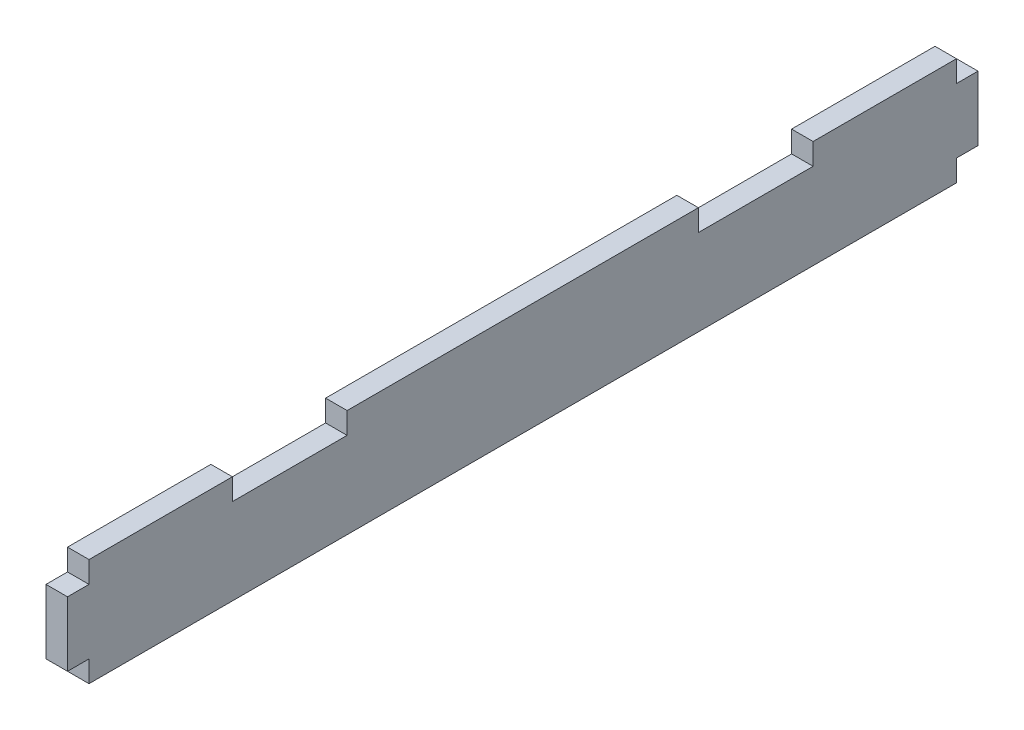
ISO-10303-21;
HEADER;
FILE_DESCRIPTION(('STEP AP214'),'2;1');
FILE_NAME('part.step','',(''),(''),'','','');
FILE_SCHEMA(('AUTOMOTIVE_DESIGN { 1 0 10303 214 1 1 1 1 }'));
ENDSEC;
DATA;
#1=APPLICATION_CONTEXT('core data for automotive mechanical design processes');
#2=APPLICATION_PROTOCOL_DEFINITION('international standard','automotive_design',2000,#1);
#3=PRODUCT_CONTEXT('',#1,'mechanical');
#4=PRODUCT('Part','Part','',(#3));
#5=PRODUCT_RELATED_PRODUCT_CATEGORY('part','',(#4));
#6=PRODUCT_DEFINITION_FORMATION('','',#4);
#7=PRODUCT_DEFINITION_CONTEXT('part definition',#1,'design');
#8=PRODUCT_DEFINITION('design','',#6,#7);
#9=PRODUCT_DEFINITION_SHAPE('','',#8);
#10=(LENGTH_UNIT() NAMED_UNIT(*) SI_UNIT(.MILLI.,.METRE.));
#11=(NAMED_UNIT(*) PLANE_ANGLE_UNIT() SI_UNIT($,.RADIAN.));
#12=(NAMED_UNIT(*) SI_UNIT($,.STERADIAN.) SOLID_ANGLE_UNIT());
#13=UNCERTAINTY_MEASURE_WITH_UNIT(LENGTH_MEASURE(1.E-05),#10,'distance_accuracy_value','');
#14=(GEOMETRIC_REPRESENTATION_CONTEXT(3) GLOBAL_UNCERTAINTY_ASSIGNED_CONTEXT((#13)) GLOBAL_UNIT_ASSIGNED_CONTEXT((#10,
#11,#12)) REPRESENTATION_CONTEXT('',''));
#15=CARTESIAN_POINT('',(0.,0.,0.));
#16=DIRECTION('',(0.,0.,1.));
#17=DIRECTION('',(1.,0.,0.));
#18=AXIS2_PLACEMENT_3D('',#15,#16,#17);
#19=CARTESIAN_POINT('',(3.,0.,-85.));
#20=DIRECTION('',(0.,0.,-1.));
#21=DIRECTION('',(-1.,0.,0.));
#22=AXIS2_PLACEMENT_3D('',#19,#20,#21);
#23=PLANE('',#22);
#24=DIRECTION('',(0.,-1.,0.));
#25=VECTOR('',#24,1.);
#26=CARTESIAN_POINT('',(0.,0.,-85.));
#27=LINE('',#26,#25);
#28=CARTESIAN_POINT('',(0.,15.,-85.));
#29=VERTEX_POINT('',#28);
#30=CARTESIAN_POINT('',(0.,12.,-85.));
#31=VERTEX_POINT('',#30);
#32=EDGE_CURVE('E274',#29,#31,#27,.T.);
#33=ORIENTED_EDGE('',*,*,#32,.F.);
#34=DIRECTION('',(-1.,0.,0.));
#35=VECTOR('',#34,1.);
#36=CARTESIAN_POINT('',(3.,15.,-85.));
#37=LINE('',#36,#35);
#38=CARTESIAN_POINT('',(3.,15.,-85.));
#39=VERTEX_POINT('',#38);
#40=EDGE_CURVE('E11',#39,#29,#37,.T.);
#41=ORIENTED_EDGE('',*,*,#40,.F.);
#42=DIRECTION('',(0.,-1.,0.));
#43=VECTOR('',#42,1.);
#44=CARTESIAN_POINT('',(3.,0.,-85.));
#45=LINE('',#44,#43);
#46=CARTESIAN_POINT('',(3.,12.,-85.));
#47=VERTEX_POINT('',#46);
#48=EDGE_CURVE('E211',#39,#47,#45,.T.);
#49=ORIENTED_EDGE('',*,*,#48,.T.);
#50=DIRECTION('',(-1.,0.,0.));
#51=VECTOR('',#50,1.);
#52=CARTESIAN_POINT('',(3.,12.,-85.));
#53=LINE('',#52,#51);
#54=EDGE_CURVE('E124',#47,#31,#53,.T.);
#55=ORIENTED_EDGE('',*,*,#54,.T.);
#56=EDGE_LOOP('',(#33,#41,#49,#55));
#57=FACE_BOUND('',#56,.T.);
#58=ADVANCED_FACE('F38',(#57),#23,.T.);
#59=CARTESIAN_POINT('',(3.,15.,0.));
#60=DIRECTION('',(0.,1.,0.));
#61=DIRECTION('',(0.,0.,1.));
#62=AXIS2_PLACEMENT_3D('',#59,#60,#61);
#63=PLANE('',#62);
#64=DIRECTION('',(0.,0.,-1.));
#65=VECTOR('',#64,1.);
#66=CARTESIAN_POINT('',(0.,15.,0.));
#67=LINE('',#66,#65);
#68=CARTESIAN_POINT('',(0.,15.,-36.));
#69=VERTEX_POINT('',#68);
#70=EDGE_CURVE('E268',#69,#29,#67,.T.);
#71=ORIENTED_EDGE('',*,*,#70,.F.);
#72=DIRECTION('',(-1.,0.,0.));
#73=VECTOR('',#72,1.);
#74=CARTESIAN_POINT('',(3.,15.,-36.));
#75=LINE('',#74,#73);
#76=CARTESIAN_POINT('',(3.,15.,-36.));
#77=VERTEX_POINT('',#76);
#78=EDGE_CURVE('E46',#77,#69,#75,.T.);
#79=ORIENTED_EDGE('',*,*,#78,.F.);
#80=DIRECTION('',(0.,0.,-1.));
#81=VECTOR('',#80,1.);
#82=CARTESIAN_POINT('',(3.,15.,0.));
#83=LINE('',#82,#81);
#84=EDGE_CURVE('E200',#77,#39,#83,.T.);
#85=ORIENTED_EDGE('',*,*,#84,.T.);
#86=ORIENTED_EDGE('',*,*,#40,.T.);
#87=EDGE_LOOP('',(#71,#79,#85,#86));
#88=FACE_BOUND('',#87,.T.);
#89=ADVANCED_FACE('F273',(#88),#63,.T.);
#90=CARTESIAN_POINT('',(3.,0.,-36.));
#91=DIRECTION('',(0.,0.,-1.));
#92=DIRECTION('',(-1.,0.,0.));
#93=AXIS2_PLACEMENT_3D('',#90,#91,#92);
#94=PLANE('',#93);
#95=DIRECTION('',(0.,-1.,0.));
#96=VECTOR('',#95,1.);
#97=CARTESIAN_POINT('',(0.,0.,-36.));
#98=LINE('',#97,#96);
#99=CARTESIAN_POINT('',(0.,12.,-36.));
#100=VERTEX_POINT('',#99);
#101=EDGE_CURVE('E262',#69,#100,#98,.T.);
#102=ORIENTED_EDGE('',*,*,#101,.T.);
#103=DIRECTION('',(-1.,0.,0.));
#104=VECTOR('',#103,1.);
#105=CARTESIAN_POINT('',(3.,12.,-36.));
#106=LINE('',#105,#104);
#107=CARTESIAN_POINT('',(3.,12.,-36.));
#108=VERTEX_POINT('',#107);
#109=EDGE_CURVE('E255',#108,#100,#106,.T.);
#110=ORIENTED_EDGE('',*,*,#109,.F.);
#111=DIRECTION('',(0.,-1.,0.));
#112=VECTOR('',#111,1.);
#113=CARTESIAN_POINT('',(3.,0.,-36.));
#114=LINE('',#113,#112);
#115=EDGE_CURVE('E210',#77,#108,#114,.T.);
#116=ORIENTED_EDGE('',*,*,#115,.F.);
#117=ORIENTED_EDGE('',*,*,#78,.T.);
#118=EDGE_LOOP('',(#102,#110,#116,#117));
#119=FACE_BOUND('',#118,.T.);
#120=ADVANCED_FACE('F260',(#119),#94,.F.);
#121=CARTESIAN_POINT('',(3.,12.,0.));
#122=DIRECTION('',(0.,1.,0.));
#123=DIRECTION('',(0.,0.,1.));
#124=AXIS2_PLACEMENT_3D('',#121,#122,#123);
#125=PLANE('',#124);
#126=DIRECTION('',(0.,0.,-1.));
#127=VECTOR('',#126,1.);
#128=CARTESIAN_POINT('',(0.,12.,0.));
#129=LINE('',#128,#127);
#130=CARTESIAN_POINT('',(0.,12.,-20.));
#131=VERTEX_POINT('',#130);
#132=EDGE_CURVE('E271',#131,#100,#129,.T.);
#133=ORIENTED_EDGE('',*,*,#132,.F.);
#134=DIRECTION('',(-1.,0.,0.));
#135=VECTOR('',#134,1.);
#136=CARTESIAN_POINT('',(3.,12.,-20.));
#137=LINE('',#136,#135);
#138=CARTESIAN_POINT('',(3.,12.,-20.));
#139=VERTEX_POINT('',#138);
#140=EDGE_CURVE('E253',#139,#131,#137,.T.);
#141=ORIENTED_EDGE('',*,*,#140,.F.);
#142=DIRECTION('',(0.,0.,-1.));
#143=VECTOR('',#142,1.);
#144=CARTESIAN_POINT('',(3.,12.,0.));
#145=LINE('',#144,#143);
#146=EDGE_CURVE('E214',#139,#108,#145,.T.);
#147=ORIENTED_EDGE('',*,*,#146,.T.);
#148=ORIENTED_EDGE('',*,*,#109,.T.);
#149=EDGE_LOOP('',(#133,#141,#147,#148));
#150=FACE_BOUND('',#149,.T.);
#151=ADVANCED_FACE('F323',(#150),#125,.T.);
#152=CARTESIAN_POINT('',(3.,0.,-20.));
#153=DIRECTION('',(0.,0.,-1.));
#154=DIRECTION('',(-1.,0.,0.));
#155=AXIS2_PLACEMENT_3D('',#152,#153,#154);
#156=PLANE('',#155);
#157=DIRECTION('',(0.,-1.,0.));
#158=VECTOR('',#157,1.);
#159=CARTESIAN_POINT('',(0.,0.,-20.));
#160=LINE('',#159,#158);
#161=CARTESIAN_POINT('',(0.,15.,-20.));
#162=VERTEX_POINT('',#161);
#163=EDGE_CURVE('E281',#162,#131,#160,.T.);
#164=ORIENTED_EDGE('',*,*,#163,.F.);
#165=DIRECTION('',(-1.,0.,0.));
#166=VECTOR('',#165,1.);
#167=CARTESIAN_POINT('',(3.,15.,-20.));
#168=LINE('',#167,#166);
#169=CARTESIAN_POINT('',(3.,15.,-20.));
#170=VERTEX_POINT('',#169);
#171=EDGE_CURVE('E251',#170,#162,#168,.T.);
#172=ORIENTED_EDGE('',*,*,#171,.F.);
#173=DIRECTION('',(0.,-1.,0.));
#174=VECTOR('',#173,1.);
#175=CARTESIAN_POINT('',(3.,0.,-20.));
#176=LINE('',#175,#174);
#177=EDGE_CURVE('E208',#170,#139,#176,.T.);
#178=ORIENTED_EDGE('',*,*,#177,.T.);
#179=ORIENTED_EDGE('',*,*,#140,.T.);
#180=EDGE_LOOP('',(#164,#172,#178,#179));
#181=FACE_BOUND('',#180,.T.);
#182=ADVANCED_FACE('F328',(#181),#156,.T.);
#183=CARTESIAN_POINT('',(0.,15.,0.));
#184=VERTEX_POINT('',#183);
#185=EDGE_CURVE('E276',#184,#162,#67,.T.);
#186=ORIENTED_EDGE('',*,*,#185,.F.);
#187=DIRECTION('',(-1.,0.,0.));
#188=VECTOR('',#187,1.);
#189=CARTESIAN_POINT('',(3.,15.,0.));
#190=LINE('',#189,#188);
#191=CARTESIAN_POINT('',(3.,15.,0.));
#192=VERTEX_POINT('',#191);
#193=EDGE_CURVE('E249',#192,#184,#190,.T.);
#194=ORIENTED_EDGE('',*,*,#193,.F.);
#195=EDGE_CURVE('E199',#192,#170,#83,.T.);
#196=ORIENTED_EDGE('',*,*,#195,.T.);
#197=ORIENTED_EDGE('',*,*,#171,.T.);
#198=EDGE_LOOP('',(#186,#194,#196,#197));
#199=FACE_BOUND('',#198,.T.);
#200=ADVANCED_FACE('F319',(#199),#63,.T.);
#201=CARTESIAN_POINT('',(3.,0.,0.));
#202=DIRECTION('',(0.,0.,1.));
#203=DIRECTION('',(1.,0.,0.));
#204=AXIS2_PLACEMENT_3D('',#201,#202,#203);
#205=PLANE('',#204);
#206=DIRECTION('',(0.,1.,0.));
#207=VECTOR('',#206,1.);
#208=CARTESIAN_POINT('',(0.,0.,0.));
#209=LINE('',#208,#207);
#210=CARTESIAN_POINT('',(0.,12.,0.));
#211=VERTEX_POINT('',#210);
#212=EDGE_CURVE('E280',#211,#184,#209,.T.);
#213=ORIENTED_EDGE('',*,*,#212,.F.);
#214=DIRECTION('',(-1.,0.,0.));
#215=VECTOR('',#214,1.);
#216=CARTESIAN_POINT('',(3.,12.,0.));
#217=LINE('',#216,#215);
#218=CARTESIAN_POINT('',(3.,12.,0.));
#219=VERTEX_POINT('',#218);
#220=EDGE_CURVE('E247',#219,#211,#217,.T.);
#221=ORIENTED_EDGE('',*,*,#220,.F.);
#222=DIRECTION('',(0.,1.,0.));
#223=VECTOR('',#222,1.);
#224=CARTESIAN_POINT('',(3.,0.,0.));
#225=LINE('',#224,#223);
#226=EDGE_CURVE('E207',#219,#192,#225,.T.);
#227=ORIENTED_EDGE('',*,*,#226,.T.);
#228=ORIENTED_EDGE('',*,*,#193,.T.);
#229=EDGE_LOOP('',(#213,#221,#227,#228));
#230=FACE_BOUND('',#229,.T.);
#231=ADVANCED_FACE('F327',(#230),#205,.T.);
#232=CARTESIAN_POINT('',(3.,12.,0.));
#233=DIRECTION('',(0.,-1.,0.));
#234=DIRECTION('',(0.,0.,-1.));
#235=AXIS2_PLACEMENT_3D('',#232,#233,#234);
#236=PLANE('',#235);
#237=DIRECTION('',(0.,0.,1.));
#238=VECTOR('',#237,1.);
#239=CARTESIAN_POINT('',(0.,12.,0.));
#240=LINE('',#239,#238);
#241=CARTESIAN_POINT('',(0.,12.,3.));
#242=VERTEX_POINT('',#241);
#243=EDGE_CURVE('E284',#211,#242,#240,.T.);
#244=ORIENTED_EDGE('',*,*,#243,.T.);
#245=DIRECTION('',(-1.,0.,0.));
#246=VECTOR('',#245,1.);
#247=CARTESIAN_POINT('',(3.,12.,3.));
#248=LINE('',#247,#246);
#249=CARTESIAN_POINT('',(3.,12.,3.));
#250=VERTEX_POINT('',#249);
#251=EDGE_CURVE('E244',#250,#242,#248,.T.);
#252=ORIENTED_EDGE('',*,*,#251,.F.);
#253=DIRECTION('',(0.,0.,1.));
#254=VECTOR('',#253,1.);
#255=CARTESIAN_POINT('',(3.,12.,0.));
#256=LINE('',#255,#254);
#257=EDGE_CURVE('E385',#219,#250,#256,.T.);
#258=ORIENTED_EDGE('',*,*,#257,.F.);
#259=ORIENTED_EDGE('',*,*,#220,.T.);
#260=EDGE_LOOP('',(#244,#252,#258,#259));
#261=FACE_BOUND('',#260,.T.);
#262=ADVANCED_FACE('F404',(#261),#236,.F.);
#263=CARTESIAN_POINT('',(3.,0.,3.));
#264=DIRECTION('',(0.,0.,-1.));
#265=DIRECTION('',(0.,1.,0.));
#266=AXIS2_PLACEMENT_3D('',#263,#264,#265);
#267=PLANE('',#266);
#268=DIRECTION('',(0.,-1.,0.));
#269=VECTOR('',#268,1.);
#270=CARTESIAN_POINT('',(0.,0.,3.));
#271=LINE('',#270,#269);
#272=CARTESIAN_POINT('',(0.,3.,3.));
#273=VERTEX_POINT('',#272);
#274=EDGE_CURVE('E292',#242,#273,#271,.T.);
#275=ORIENTED_EDGE('',*,*,#274,.T.);
#276=DIRECTION('',(-1.,0.,0.));
#277=VECTOR('',#276,1.);
#278=CARTESIAN_POINT('',(3.,3.,3.));
#279=LINE('',#278,#277);
#280=CARTESIAN_POINT('',(3.,3.,3.));
#281=VERTEX_POINT('',#280);
#282=EDGE_CURVE('E242',#281,#273,#279,.T.);
#283=ORIENTED_EDGE('',*,*,#282,.F.);
#284=DIRECTION('',(0.,-1.,0.));
#285=VECTOR('',#284,1.);
#286=CARTESIAN_POINT('',(3.,0.,3.));
#287=LINE('',#286,#285);
#288=EDGE_CURVE('E383',#250,#281,#287,.T.);
#289=ORIENTED_EDGE('',*,*,#288,.F.);
#290=ORIENTED_EDGE('',*,*,#251,.T.);
#291=EDGE_LOOP('',(#275,#283,#289,#290));
#292=FACE_BOUND('',#291,.T.);
#293=ADVANCED_FACE('F411',(#292),#267,.F.);
#294=CARTESIAN_POINT('',(3.,3.,0.));
#295=DIRECTION('',(0.,-1.,0.));
#296=DIRECTION('',(0.,0.,-1.));
#297=AXIS2_PLACEMENT_3D('',#294,#295,#296);
#298=PLANE('',#297);
#299=DIRECTION('',(0.,0.,1.));
#300=VECTOR('',#299,1.);
#301=CARTESIAN_POINT('',(0.,3.,0.));
#302=LINE('',#301,#300);
#303=CARTESIAN_POINT('',(0.,3.,0.));
#304=VERTEX_POINT('',#303);
#305=EDGE_CURVE('E295',#304,#273,#302,.T.);
#306=ORIENTED_EDGE('',*,*,#305,.F.);
#307=DIRECTION('',(-1.,0.,0.));
#308=VECTOR('',#307,1.);
#309=CARTESIAN_POINT('',(3.,3.,0.));
#310=LINE('',#309,#308);
#311=CARTESIAN_POINT('',(3.,3.,0.));
#312=VERTEX_POINT('',#311);
#313=EDGE_CURVE('E240',#312,#304,#310,.T.);
#314=ORIENTED_EDGE('',*,*,#313,.F.);
#315=DIRECTION('',(0.,0.,1.));
#316=VECTOR('',#315,1.);
#317=CARTESIAN_POINT('',(3.,3.,0.));
#318=LINE('',#317,#316);
#319=EDGE_CURVE('E380',#312,#281,#318,.T.);
#320=ORIENTED_EDGE('',*,*,#319,.T.);
#321=ORIENTED_EDGE('',*,*,#282,.T.);
#322=EDGE_LOOP('',(#306,#314,#320,#321));
#323=FACE_BOUND('',#322,.T.);
#324=ADVANCED_FACE('F415',(#323),#298,.T.);
#325=CARTESIAN_POINT('',(0.,0.,0.));
#326=VERTEX_POINT('',#325);
#327=EDGE_CURVE('E286',#326,#304,#209,.T.);
#328=ORIENTED_EDGE('',*,*,#327,.F.);
#329=DIRECTION('',(-1.,0.,0.));
#330=VECTOR('',#329,1.);
#331=CARTESIAN_POINT('',(3.,0.,0.));
#332=LINE('',#331,#330);
#333=CARTESIAN_POINT('',(3.,0.,0.));
#334=VERTEX_POINT('',#333);
#335=EDGE_CURVE('E238',#334,#326,#332,.T.);
#336=ORIENTED_EDGE('',*,*,#335,.F.);
#337=EDGE_CURVE('E379',#334,#312,#225,.T.);
#338=ORIENTED_EDGE('',*,*,#337,.T.);
#339=ORIENTED_EDGE('',*,*,#313,.T.);
#340=EDGE_LOOP('',(#328,#336,#338,#339));
#341=FACE_BOUND('',#340,.T.);
#342=ADVANCED_FACE('F354',(#341),#205,.T.);
#343=CARTESIAN_POINT('',(3.,0.,0.));
#344=DIRECTION('',(0.,1.,0.));
#345=DIRECTION('',(0.,0.,1.));
#346=AXIS2_PLACEMENT_3D('',#343,#344,#345);
#347=PLANE('',#346);
#348=DIRECTION('',(0.,0.,-1.));
#349=VECTOR('',#348,1.);
#350=CARTESIAN_POINT('',(0.,0.,0.));
#351=LINE('',#350,#349);
#352=CARTESIAN_POINT('',(0.,0.,-121.));
#353=VERTEX_POINT('',#352);
#354=EDGE_CURVE('E298',#326,#353,#351,.T.);
#355=ORIENTED_EDGE('',*,*,#354,.T.);
#356=DIRECTION('',(-1.,0.,0.));
#357=VECTOR('',#356,1.);
#358=CARTESIAN_POINT('',(3.,0.,-121.));
#359=LINE('',#358,#357);
#360=CARTESIAN_POINT('',(3.,0.,-121.));
#361=VERTEX_POINT('',#360);
#362=EDGE_CURVE('E235',#361,#353,#359,.T.);
#363=ORIENTED_EDGE('',*,*,#362,.F.);
#364=DIRECTION('',(0.,0.,-1.));
#365=VECTOR('',#364,1.);
#366=CARTESIAN_POINT('',(3.,0.,0.));
#367=LINE('',#366,#365);
#368=EDGE_CURVE('E377',#334,#361,#367,.T.);
#369=ORIENTED_EDGE('',*,*,#368,.F.);
#370=ORIENTED_EDGE('',*,*,#335,.T.);
#371=EDGE_LOOP('',(#355,#363,#369,#370));
#372=FACE_BOUND('',#371,.T.);
#373=ADVANCED_FACE('F346',(#372),#347,.F.);
#374=CARTESIAN_POINT('',(3.,0.,-121.));
#375=DIRECTION('',(0.,0.,1.));
#376=DIRECTION('',(1.,0.,0.));
#377=AXIS2_PLACEMENT_3D('',#374,#375,#376);
#378=PLANE('',#377);
#379=DIRECTION('',(0.,1.,0.));
#380=VECTOR('',#379,1.);
#381=CARTESIAN_POINT('',(0.,0.,-121.));
#382=LINE('',#381,#380);
#383=CARTESIAN_POINT('',(0.,3.,-121.));
#384=VERTEX_POINT('',#383);
#385=EDGE_CURVE('E300',#353,#384,#382,.T.);
#386=ORIENTED_EDGE('',*,*,#385,.T.);
#387=DIRECTION('',(-1.,0.,0.));
#388=VECTOR('',#387,1.);
#389=CARTESIAN_POINT('',(3.,3.,-121.));
#390=LINE('',#389,#388);
#391=CARTESIAN_POINT('',(3.,3.,-121.));
#392=VERTEX_POINT('',#391);
#393=EDGE_CURVE('E232',#392,#384,#390,.T.);
#394=ORIENTED_EDGE('',*,*,#393,.F.);
#395=DIRECTION('',(0.,1.,0.));
#396=VECTOR('',#395,1.);
#397=CARTESIAN_POINT('',(3.,0.,-121.));
#398=LINE('',#397,#396);
#399=EDGE_CURVE('E203',#361,#392,#398,.T.);
#400=ORIENTED_EDGE('',*,*,#399,.F.);
#401=ORIENTED_EDGE('',*,*,#362,.T.);
#402=EDGE_LOOP('',(#386,#394,#400,#401));
#403=FACE_BOUND('',#402,.T.);
#404=ADVANCED_FACE('F337',(#403),#378,.F.);
#405=CARTESIAN_POINT('',(3.,3.00000000000007,0.));
#406=DIRECTION('',(0.,1.,0.));
#407=DIRECTION('',(0.,0.,1.));
#408=AXIS2_PLACEMENT_3D('',#405,#406,#407);
#409=PLANE('',#408);
#410=DIRECTION('',(0.,0.,-1.));
#411=VECTOR('',#410,1.);
#412=CARTESIAN_POINT('',(0.,3.00000000000007,0.));
#413=LINE('',#412,#411);
#414=CARTESIAN_POINT('',(0.,3.,-124.));
#415=VERTEX_POINT('',#414);
#416=EDGE_CURVE('E302',#384,#415,#413,.T.);
#417=ORIENTED_EDGE('',*,*,#416,.T.);
#418=DIRECTION('',(-1.,0.,0.));
#419=VECTOR('',#418,1.);
#420=CARTESIAN_POINT('',(3.,3.,-124.));
#421=LINE('',#420,#419);
#422=CARTESIAN_POINT('',(3.,3.,-124.));
#423=VERTEX_POINT('',#422);
#424=EDGE_CURVE('E230',#423,#415,#421,.T.);
#425=ORIENTED_EDGE('',*,*,#424,.F.);
#426=DIRECTION('',(0.,0.,-1.));
#427=VECTOR('',#426,1.);
#428=CARTESIAN_POINT('',(3.,3.00000000000007,0.));
#429=LINE('',#428,#427);
#430=EDGE_CURVE('E365',#392,#423,#429,.T.);
#431=ORIENTED_EDGE('',*,*,#430,.F.);
#432=ORIENTED_EDGE('',*,*,#393,.T.);
#433=EDGE_LOOP('',(#417,#425,#431,#432));
#434=FACE_BOUND('',#433,.T.);
#435=ADVANCED_FACE('F345',(#434),#409,.F.);
#436=CARTESIAN_POINT('',(3.,0.,-124.));
#437=DIRECTION('',(0.,0.,-1.));
#438=DIRECTION('',(-1.,0.,0.));
#439=AXIS2_PLACEMENT_3D('',#436,#437,#438);
#440=PLANE('',#439);
#441=DIRECTION('',(0.,-1.,0.));
#442=VECTOR('',#441,1.);
#443=CARTESIAN_POINT('',(0.,0.,-124.));
#444=LINE('',#443,#442);
#445=CARTESIAN_POINT('',(0.,12.,-124.));
#446=VERTEX_POINT('',#445);
#447=EDGE_CURVE('E305',#446,#415,#444,.T.);
#448=ORIENTED_EDGE('',*,*,#447,.F.);
#449=DIRECTION('',(-1.,0.,0.));
#450=VECTOR('',#449,1.);
#451=CARTESIAN_POINT('',(3.,12.,-124.));
#452=LINE('',#451,#450);
#453=CARTESIAN_POINT('',(3.,12.,-124.));
#454=VERTEX_POINT('',#453);
#455=EDGE_CURVE('E228',#454,#446,#452,.T.);
#456=ORIENTED_EDGE('',*,*,#455,.F.);
#457=DIRECTION('',(0.,-1.,0.));
#458=VECTOR('',#457,1.);
#459=CARTESIAN_POINT('',(3.,0.,-124.));
#460=LINE('',#459,#458);
#461=EDGE_CURVE('E370',#454,#423,#460,.T.);
#462=ORIENTED_EDGE('',*,*,#461,.T.);
#463=ORIENTED_EDGE('',*,*,#424,.T.);
#464=EDGE_LOOP('',(#448,#456,#462,#463));
#465=FACE_BOUND('',#464,.T.);
#466=ADVANCED_FACE('F341',(#465),#440,.T.);
#467=CARTESIAN_POINT('',(3.,12.,0.));
#468=DIRECTION('',(0.,1.,0.));
#469=DIRECTION('',(0.,0.,1.));
#470=AXIS2_PLACEMENT_3D('',#467,#468,#469);
#471=PLANE('',#470);
#472=DIRECTION('',(0.,0.,-1.));
#473=VECTOR('',#472,1.);
#474=CARTESIAN_POINT('',(0.,12.,0.));
#475=LINE('',#474,#473);
#476=CARTESIAN_POINT('',(0.,12.,-121.));
#477=VERTEX_POINT('',#476);
#478=EDGE_CURVE('E307',#477,#446,#475,.T.);
#479=ORIENTED_EDGE('',*,*,#478,.F.);
#480=DIRECTION('',(-1.,0.,0.));
#481=VECTOR('',#480,1.);
#482=CARTESIAN_POINT('',(3.,12.,-121.));
#483=LINE('',#482,#481);
#484=CARTESIAN_POINT('',(3.,12.,-121.));
#485=VERTEX_POINT('',#484);
#486=EDGE_CURVE('E226',#485,#477,#483,.T.);
#487=ORIENTED_EDGE('',*,*,#486,.F.);
#488=DIRECTION('',(0.,0.,-1.));
#489=VECTOR('',#488,1.);
#490=CARTESIAN_POINT('',(3.,12.,0.));
#491=LINE('',#490,#489);
#492=EDGE_CURVE('E201',#485,#454,#491,.T.);
#493=ORIENTED_EDGE('',*,*,#492,.T.);
#494=ORIENTED_EDGE('',*,*,#455,.T.);
#495=EDGE_LOOP('',(#479,#487,#493,#494));
#496=FACE_BOUND('',#495,.T.);
#497=ADVANCED_FACE('F336',(#496),#471,.T.);
#498=CARTESIAN_POINT('',(0.,15.,-121.));
#499=VERTEX_POINT('',#498);
#500=EDGE_CURVE('E278',#477,#499,#382,.T.);
#501=ORIENTED_EDGE('',*,*,#500,.T.);
#502=DIRECTION('',(-1.,0.,0.));
#503=VECTOR('',#502,1.);
#504=CARTESIAN_POINT('',(3.,15.,-121.));
#505=LINE('',#504,#503);
#506=CARTESIAN_POINT('',(3.,15.,-121.));
#507=VERTEX_POINT('',#506);
#508=EDGE_CURVE('E187',#507,#499,#505,.T.);
#509=ORIENTED_EDGE('',*,*,#508,.F.);
#510=EDGE_CURVE('E196',#485,#507,#398,.T.);
#511=ORIENTED_EDGE('',*,*,#510,.F.);
#512=ORIENTED_EDGE('',*,*,#486,.T.);
#513=EDGE_LOOP('',(#501,#509,#511,#512));
#514=FACE_BOUND('',#513,.T.);
#515=ADVANCED_FACE('F313',(#514),#378,.F.);
#516=CARTESIAN_POINT('',(0.,15.,-101.));
#517=VERTEX_POINT('',#516);
#518=EDGE_CURVE('E186',#517,#499,#67,.T.);
#519=ORIENTED_EDGE('',*,*,#518,.F.);
#520=DIRECTION('',(-1.,0.,0.));
#521=VECTOR('',#520,1.);
#522=CARTESIAN_POINT('',(3.,15.,-101.));
#523=LINE('',#522,#521);
#524=CARTESIAN_POINT('',(3.,15.,-101.));
#525=VERTEX_POINT('',#524);
#526=EDGE_CURVE('E180',#525,#517,#523,.T.);
#527=ORIENTED_EDGE('',*,*,#526,.F.);
#528=EDGE_CURVE('E184',#525,#507,#83,.T.);
#529=ORIENTED_EDGE('',*,*,#528,.T.);
#530=ORIENTED_EDGE('',*,*,#508,.T.);
#531=EDGE_LOOP('',(#519,#527,#529,#530));
#532=FACE_BOUND('',#531,.T.);
#533=ADVANCED_FACE('F182',(#532),#63,.T.);
#534=CARTESIAN_POINT('',(3.,0.,-101.));
#535=DIRECTION('',(0.,0.,-1.));
#536=DIRECTION('',(-1.,0.,0.));
#537=AXIS2_PLACEMENT_3D('',#534,#535,#536);
#538=PLANE('',#537);
#539=DIRECTION('',(0.,-1.,0.));
#540=VECTOR('',#539,1.);
#541=CARTESIAN_POINT('',(0.,0.,-101.));
#542=LINE('',#541,#540);
#543=CARTESIAN_POINT('',(0.,12.,-101.));
#544=VERTEX_POINT('',#543);
#545=EDGE_CURVE('E117',#517,#544,#542,.T.);
#546=ORIENTED_EDGE('',*,*,#545,.T.);
#547=DIRECTION('',(-1.,0.,0.));
#548=VECTOR('',#547,1.);
#549=CARTESIAN_POINT('',(3.,12.,-101.));
#550=LINE('',#549,#548);
#551=CARTESIAN_POINT('',(3.,12.,-101.));
#552=VERTEX_POINT('',#551);
#553=EDGE_CURVE('E188',#552,#544,#550,.T.);
#554=ORIENTED_EDGE('',*,*,#553,.F.);
#555=DIRECTION('',(0.,-1.,0.));
#556=VECTOR('',#555,1.);
#557=CARTESIAN_POINT('',(3.,0.,-101.));
#558=LINE('',#557,#556);
#559=EDGE_CURVE('E190',#525,#552,#558,.T.);
#560=ORIENTED_EDGE('',*,*,#559,.F.);
#561=ORIENTED_EDGE('',*,*,#526,.T.);
#562=EDGE_LOOP('',(#546,#554,#560,#561));
#563=FACE_BOUND('',#562,.T.);
#564=ADVANCED_FACE('F191',(#563),#538,.F.);
#565=CARTESIAN_POINT('',(3.,12.,0.));
#566=DIRECTION('',(0.,-1.,0.));
#567=DIRECTION('',(0.,0.,-1.));
#568=AXIS2_PLACEMENT_3D('',#565,#566,#567);
#569=PLANE('',#568);
#570=DIRECTION('',(0.,0.,1.));
#571=VECTOR('',#570,1.);
#572=CARTESIAN_POINT('',(0.,12.,0.));
#573=LINE('',#572,#571);
#574=EDGE_CURVE('E215',#544,#31,#573,.T.);
#575=ORIENTED_EDGE('',*,*,#574,.T.);
#576=ORIENTED_EDGE('',*,*,#54,.F.);
#577=DIRECTION('',(0.,0.,1.));
#578=VECTOR('',#577,1.);
#579=CARTESIAN_POINT('',(3.,12.,0.));
#580=LINE('',#579,#578);
#581=EDGE_CURVE('E54',#552,#47,#580,.T.);
#582=ORIENTED_EDGE('',*,*,#581,.F.);
#583=ORIENTED_EDGE('',*,*,#553,.T.);
#584=EDGE_LOOP('',(#575,#576,#582,#583));
#585=FACE_BOUND('',#584,.T.);
#586=ADVANCED_FACE('F335',(#585),#569,.F.);
#587=CARTESIAN_POINT('',(3.,0.,0.));
#588=DIRECTION('',(1.,0.,0.));
#589=DIRECTION('',(0.,0.,-1.));
#590=AXIS2_PLACEMENT_3D('',#587,#588,#589);
#591=PLANE('',#590);
#592=ORIENTED_EDGE('',*,*,#48,.F.);
#593=ORIENTED_EDGE('',*,*,#84,.F.);
#594=ORIENTED_EDGE('',*,*,#115,.T.);
#595=ORIENTED_EDGE('',*,*,#146,.F.);
#596=ORIENTED_EDGE('',*,*,#177,.F.);
#597=ORIENTED_EDGE('',*,*,#195,.F.);
#598=ORIENTED_EDGE('',*,*,#226,.F.);
#599=ORIENTED_EDGE('',*,*,#257,.T.);
#600=ORIENTED_EDGE('',*,*,#288,.T.);
#601=ORIENTED_EDGE('',*,*,#319,.F.);
#602=ORIENTED_EDGE('',*,*,#337,.F.);
#603=ORIENTED_EDGE('',*,*,#368,.T.);
#604=ORIENTED_EDGE('',*,*,#399,.T.);
#605=ORIENTED_EDGE('',*,*,#430,.T.);
#606=ORIENTED_EDGE('',*,*,#461,.F.);
#607=ORIENTED_EDGE('',*,*,#492,.F.);
#608=ORIENTED_EDGE('',*,*,#510,.T.);
#609=ORIENTED_EDGE('',*,*,#528,.F.);
#610=ORIENTED_EDGE('',*,*,#559,.T.);
#611=ORIENTED_EDGE('',*,*,#581,.T.);
#612=EDGE_LOOP('',(#592,#593,#594,#595,#596,#597,#598,#599,#600,#601,#602,#603,#604,#605,#606,
#607,#608,#609,#610,#611));
#613=FACE_BOUND('',#612,.T.);
#614=ADVANCED_FACE('F193',(#613),#591,.T.);
#615=CARTESIAN_POINT('',(0.,0.,0.));
#616=DIRECTION('',(1.,0.,0.));
#617=DIRECTION('',(0.,0.,-1.));
#618=AXIS2_PLACEMENT_3D('',#615,#616,#617);
#619=PLANE('',#618);
#620=ORIENTED_EDGE('',*,*,#32,.T.);
#621=ORIENTED_EDGE('',*,*,#574,.F.);
#622=ORIENTED_EDGE('',*,*,#545,.F.);
#623=ORIENTED_EDGE('',*,*,#518,.T.);
#624=ORIENTED_EDGE('',*,*,#500,.F.);
#625=ORIENTED_EDGE('',*,*,#478,.T.);
#626=ORIENTED_EDGE('',*,*,#447,.T.);
#627=ORIENTED_EDGE('',*,*,#416,.F.);
#628=ORIENTED_EDGE('',*,*,#385,.F.);
#629=ORIENTED_EDGE('',*,*,#354,.F.);
#630=ORIENTED_EDGE('',*,*,#327,.T.);
#631=ORIENTED_EDGE('',*,*,#305,.T.);
#632=ORIENTED_EDGE('',*,*,#274,.F.);
#633=ORIENTED_EDGE('',*,*,#243,.F.);
#634=ORIENTED_EDGE('',*,*,#212,.T.);
#635=ORIENTED_EDGE('',*,*,#185,.T.);
#636=ORIENTED_EDGE('',*,*,#163,.T.);
#637=ORIENTED_EDGE('',*,*,#132,.T.);
#638=ORIENTED_EDGE('',*,*,#101,.F.);
#639=ORIENTED_EDGE('',*,*,#70,.T.);
#640=EDGE_LOOP('',(#620,#621,#622,#623,#624,#625,#626,#627,#628,#629,#630,#631,#632,#633,#634,
#635,#636,#637,#638,#639));
#641=FACE_BOUND('',#640,.T.);
#642=ADVANCED_FACE('F267',(#641),#619,.F.);
#643=CLOSED_SHELL('',(#58,#89,#120,#151,#182,#200,#231,#262,#293,#324,#342,#373,#404,#435,#466,
#497,#515,#533,#564,#586,#614,#642));
#644=MANIFOLD_SOLID_BREP('B2',#643);
#645=ADVANCED_BREP_SHAPE_REPRESENTATION('',(#18,#644),#14);
#646=SHAPE_DEFINITION_REPRESENTATION(#9,#645);
ENDSEC;
END-ISO-10303-21;
